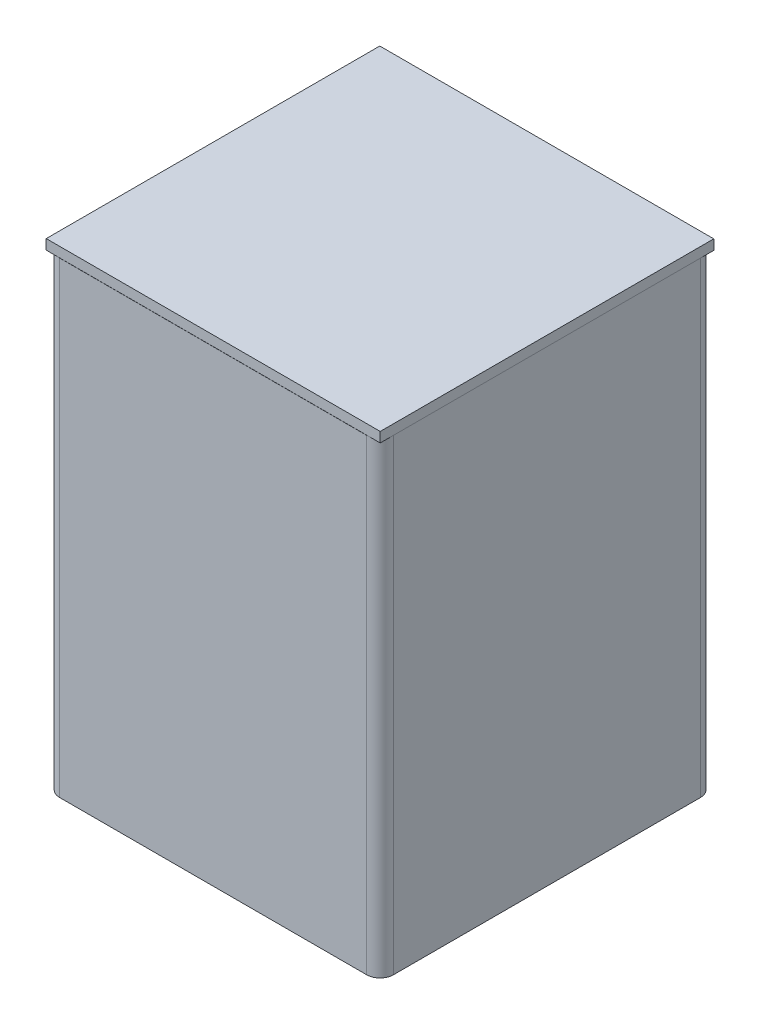
ISO-10303-21;
HEADER;
FILE_DESCRIPTION(('STEP AP214'),'2;1');
FILE_NAME('part.step','',(''),(''),'','','');
FILE_SCHEMA(('AUTOMOTIVE_DESIGN { 1 0 10303 214 1 1 1 1 }'));
ENDSEC;
DATA;
#1=APPLICATION_CONTEXT('core data for automotive mechanical design processes');
#2=APPLICATION_PROTOCOL_DEFINITION('international standard','automotive_design',2000,#1);
#3=PRODUCT_CONTEXT('',#1,'mechanical');
#4=PRODUCT('Part','Part','',(#3));
#5=PRODUCT_RELATED_PRODUCT_CATEGORY('part','',(#4));
#6=PRODUCT_DEFINITION_FORMATION('','',#4);
#7=PRODUCT_DEFINITION_CONTEXT('part definition',#1,'design');
#8=PRODUCT_DEFINITION('design','',#6,#7);
#9=PRODUCT_DEFINITION_SHAPE('','',#8);
#10=(LENGTH_UNIT() NAMED_UNIT(*) SI_UNIT(.MILLI.,.METRE.));
#11=(NAMED_UNIT(*) PLANE_ANGLE_UNIT() SI_UNIT($,.RADIAN.));
#12=(NAMED_UNIT(*) SI_UNIT($,.STERADIAN.) SOLID_ANGLE_UNIT());
#13=UNCERTAINTY_MEASURE_WITH_UNIT(LENGTH_MEASURE(1.E-05),#10,'distance_accuracy_value','');
#14=(GEOMETRIC_REPRESENTATION_CONTEXT(3) GLOBAL_UNCERTAINTY_ASSIGNED_CONTEXT((#13)) GLOBAL_UNIT_ASSIGNED_CONTEXT((#10,
#11,#12)) REPRESENTATION_CONTEXT('',''));
#15=CARTESIAN_POINT('',(0.,0.,0.));
#16=DIRECTION('',(0.,0.,1.));
#17=DIRECTION('',(1.,0.,0.));
#18=AXIS2_PLACEMENT_3D('',#15,#16,#17);
#19=CARTESIAN_POINT('',(59.0204470121358,181.61,107.541873644014));
#20=DIRECTION('',(0.,0.,1.));
#21=DIRECTION('',(1.,0.,0.));
#22=AXIS2_PLACEMENT_3D('',#19,#20,#21);
#23=PLANE('',#22);
#24=DIRECTION('',(-1.,0.,0.));
#25=VECTOR('',#24,1.);
#26=CARTESIAN_POINT('',(59.0204470121358,177.8,107.541873644014));
#27=LINE('',#26,#25);
#28=CARTESIAN_POINT('',(59.0204470121358,177.8,107.541873644014));
#29=VERTEX_POINT('',#28);
#30=CARTESIAN_POINT('',(-68.0926954382775,177.8,107.541873644014));
#31=VERTEX_POINT('',#30);
#32=EDGE_CURVE('E179',#29,#31,#27,.T.);
#33=ORIENTED_EDGE('',*,*,#32,.F.);
#34=DIRECTION('',(0.,-1.,0.));
#35=VECTOR('',#34,1.);
#36=CARTESIAN_POINT('',(59.0204470121358,181.61,107.541873644014));
#37=LINE('',#36,#35);
#38=CARTESIAN_POINT('',(59.0204470121358,181.61,107.541873644014));
#39=VERTEX_POINT('',#38);
#40=EDGE_CURVE('E12',#39,#29,#37,.T.);
#41=ORIENTED_EDGE('',*,*,#40,.F.);
#42=DIRECTION('',(-1.,0.,0.));
#43=VECTOR('',#42,1.);
#44=CARTESIAN_POINT('',(59.0204470121358,181.61,107.541873644014));
#45=LINE('',#44,#43);
#46=CARTESIAN_POINT('',(-68.0926954382775,181.61,107.541873644014));
#47=VERTEX_POINT('',#46);
#48=EDGE_CURVE('E185',#39,#47,#45,.T.);
#49=ORIENTED_EDGE('',*,*,#48,.T.);
#50=DIRECTION('',(0.,-1.,0.));
#51=VECTOR('',#50,1.);
#52=CARTESIAN_POINT('',(-68.0926954382775,181.61,107.541873644014));
#53=LINE('',#52,#51);
#54=EDGE_CURVE('E64',#47,#31,#53,.T.);
#55=ORIENTED_EDGE('',*,*,#54,.T.);
#56=EDGE_LOOP('',(#33,#41,#49,#55));
#57=FACE_BOUND('',#56,.T.);
#58=ADVANCED_FACE('F61',(#57),#23,.T.);
#59=CARTESIAN_POINT('',(59.0204470121358,181.61,-19.3985737263647));
#60=DIRECTION('',(1.,0.,0.));
#61=DIRECTION('',(0.,0.,-1.));
#62=AXIS2_PLACEMENT_3D('',#59,#60,#61);
#63=PLANE('',#62);
#64=DIRECTION('',(0.,0.,1.));
#65=VECTOR('',#64,1.);
#66=CARTESIAN_POINT('',(59.0204470121358,177.8,-19.3985737263647));
#67=LINE('',#66,#65);
#68=CARTESIAN_POINT('',(59.0204470121358,177.8,-19.3985737263647));
#69=VERTEX_POINT('',#68);
#70=EDGE_CURVE('E188',#69,#29,#67,.T.);
#71=ORIENTED_EDGE('',*,*,#70,.F.);
#72=DIRECTION('',(0.,-1.,0.));
#73=VECTOR('',#72,1.);
#74=CARTESIAN_POINT('',(59.0204470121358,181.61,-19.3985737263647));
#75=LINE('',#74,#73);
#76=CARTESIAN_POINT('',(59.0204470121358,181.61,-19.3985737263647));
#77=VERTEX_POINT('',#76);
#78=EDGE_CURVE('E70',#77,#69,#75,.T.);
#79=ORIENTED_EDGE('',*,*,#78,.F.);
#80=DIRECTION('',(0.,0.,1.));
#81=VECTOR('',#80,1.);
#82=CARTESIAN_POINT('',(59.0204470121358,181.61,-19.3985737263647));
#83=LINE('',#82,#81);
#84=EDGE_CURVE('E194',#77,#39,#83,.T.);
#85=ORIENTED_EDGE('',*,*,#84,.T.);
#86=ORIENTED_EDGE('',*,*,#40,.T.);
#87=EDGE_LOOP('',(#71,#79,#85,#86));
#88=FACE_BOUND('',#87,.T.);
#89=ADVANCED_FACE('F222',(#88),#63,.T.);
#90=CARTESIAN_POINT('',(59.0204470121358,181.61,-19.3985737263647));
#91=DIRECTION('',(0.,0.,1.));
#92=DIRECTION('',(1.,0.,0.));
#93=AXIS2_PLACEMENT_3D('',#90,#91,#92);
#94=PLANE('',#93);
#95=DIRECTION('',(-1.,0.,0.));
#96=VECTOR('',#95,1.);
#97=CARTESIAN_POINT('',(59.0204470121358,177.8,-19.3985737263647));
#98=LINE('',#97,#96);
#99=CARTESIAN_POINT('',(-68.0926954382775,177.8,-19.3985737263647));
#100=VERTEX_POINT('',#99);
#101=EDGE_CURVE('E204',#69,#100,#98,.T.);
#102=ORIENTED_EDGE('',*,*,#101,.T.);
#103=DIRECTION('',(0.,-1.,0.));
#104=VECTOR('',#103,1.);
#105=CARTESIAN_POINT('',(-68.0926954382775,181.61,-19.3985737263647));
#106=LINE('',#105,#104);
#107=CARTESIAN_POINT('',(-68.0926954382775,181.61,-19.3985737263647));
#108=VERTEX_POINT('',#107);
#109=EDGE_CURVE('E211',#108,#100,#106,.T.);
#110=ORIENTED_EDGE('',*,*,#109,.F.);
#111=DIRECTION('',(-1.,0.,0.));
#112=VECTOR('',#111,1.);
#113=CARTESIAN_POINT('',(59.0204470121358,181.61,-19.3985737263647));
#114=LINE('',#113,#112);
#115=EDGE_CURVE('E191',#77,#108,#114,.T.);
#116=ORIENTED_EDGE('',*,*,#115,.F.);
#117=ORIENTED_EDGE('',*,*,#78,.T.);
#118=EDGE_LOOP('',(#102,#110,#116,#117));
#119=FACE_BOUND('',#118,.T.);
#120=ADVANCED_FACE('F226',(#119),#94,.F.);
#121=CARTESIAN_POINT('',(-68.0926954382775,181.61,-19.3985737263647));
#122=DIRECTION('',(1.,0.,0.));
#123=DIRECTION('',(0.,0.,-1.));
#124=AXIS2_PLACEMENT_3D('',#121,#122,#123);
#125=PLANE('',#124);
#126=DIRECTION('',(0.,0.,1.));
#127=VECTOR('',#126,1.);
#128=CARTESIAN_POINT('',(-68.0926954382775,177.8,-19.3985737263647));
#129=LINE('',#128,#127);
#130=EDGE_CURVE('E200',#100,#31,#129,.T.);
#131=ORIENTED_EDGE('',*,*,#130,.T.);
#132=ORIENTED_EDGE('',*,*,#54,.F.);
#133=DIRECTION('',(0.,0.,1.));
#134=VECTOR('',#133,1.);
#135=CARTESIAN_POINT('',(-68.0926954382775,181.61,-19.3985737263647));
#136=LINE('',#135,#134);
#137=EDGE_CURVE('E111',#108,#47,#136,.T.);
#138=ORIENTED_EDGE('',*,*,#137,.F.);
#139=ORIENTED_EDGE('',*,*,#109,.T.);
#140=EDGE_LOOP('',(#131,#132,#138,#139));
#141=FACE_BOUND('',#140,.T.);
#142=ADVANCED_FACE('F218',(#141),#125,.F.);
#143=CARTESIAN_POINT('',(0.,181.61,0.));
#144=DIRECTION('',(0.,1.,0.));
#145=DIRECTION('',(0.,0.,1.));
#146=AXIS2_PLACEMENT_3D('',#143,#144,#145);
#147=PLANE('',#146);
#148=ORIENTED_EDGE('',*,*,#48,.F.);
#149=ORIENTED_EDGE('',*,*,#84,.F.);
#150=ORIENTED_EDGE('',*,*,#115,.T.);
#151=ORIENTED_EDGE('',*,*,#137,.T.);
#152=EDGE_LOOP('',(#148,#149,#150,#151));
#153=FACE_BOUND('',#152,.T.);
#154=ADVANCED_FACE('F227',(#153),#147,.T.);
#155=CARTESIAN_POINT('',(0.,177.8,0.));
#156=DIRECTION('',(0.,1.,0.));
#157=DIRECTION('',(0.,0.,1.));
#158=AXIS2_PLACEMENT_3D('',#155,#156,#157);
#159=PLANE('',#158);
#160=DIRECTION('',(0.,0.,1.));
#161=VECTOR('',#160,1.);
#162=CARTESIAN_POINT('',(-62.8995529878642,177.8,-14.3185737263647));
#163=LINE('',#162,#161);
#164=CARTESIAN_POINT('',(-62.8995529878642,177.8,-14.3185737263647));
#165=VERTEX_POINT('',#164);
#166=CARTESIAN_POINT('',(-62.8995529878642,177.8,102.521426273635));
#167=VERTEX_POINT('',#166);
#168=EDGE_CURVE('E160',#165,#167,#163,.T.);
#169=ORIENTED_EDGE('',*,*,#168,.T.);
#170=DIRECTION('',(1.,0.,0.));
#171=VECTOR('',#170,1.);
#172=CARTESIAN_POINT('',(-62.8995529878642,177.8,102.521426273635));
#173=LINE('',#172,#171);
#174=CARTESIAN_POINT('',(53.9404470121358,177.8,102.521426273635));
#175=VERTEX_POINT('',#174);
#176=EDGE_CURVE('E78',#167,#175,#173,.T.);
#177=ORIENTED_EDGE('',*,*,#176,.T.);
#178=DIRECTION('',(0.,0.,1.));
#179=VECTOR('',#178,1.);
#180=CARTESIAN_POINT('',(53.9404470121358,177.8,-14.3185737263647));
#181=LINE('',#180,#179);
#182=CARTESIAN_POINT('',(53.9404470121358,177.8,-14.3185737263647));
#183=VERTEX_POINT('',#182);
#184=EDGE_CURVE('E152',#183,#175,#181,.T.);
#185=ORIENTED_EDGE('',*,*,#184,.F.);
#186=DIRECTION('',(1.,0.,0.));
#187=VECTOR('',#186,1.);
#188=CARTESIAN_POINT('',(-62.8995529878642,177.8,-14.3185737263647));
#189=LINE('',#188,#187);
#190=EDGE_CURVE('E164',#165,#183,#189,.T.);
#191=ORIENTED_EDGE('',*,*,#190,.F.);
#192=EDGE_LOOP('',(#169,#177,#185,#191));
#193=FACE_BOUND('',#192,.T.);
#194=ORIENTED_EDGE('',*,*,#32,.T.);
#195=ORIENTED_EDGE('',*,*,#130,.F.);
#196=ORIENTED_EDGE('',*,*,#101,.F.);
#197=ORIENTED_EDGE('',*,*,#70,.T.);
#198=EDGE_LOOP('',(#194,#195,#196,#197));
#199=FACE_BOUND('',#198,.T.);
#200=ADVANCED_FACE('F221',(#193,#199),#159,.F.);
#201=CARTESIAN_POINT('',(-62.8995529878642,165.1,102.521426273635));
#202=DIRECTION('',(0.,0.,1.));
#203=DIRECTION('',(1.,0.,0.));
#204=AXIS2_PLACEMENT_3D('',#201,#202,#203);
#205=PLANE('',#204);
#206=ORIENTED_EDGE('',*,*,#176,.F.);
#207=DIRECTION('',(0.,1.,0.));
#208=VECTOR('',#207,1.);
#209=CARTESIAN_POINT('',(-62.8995529878642,165.1,102.521426273635));
#210=LINE('',#209,#208);
#211=CARTESIAN_POINT('',(-62.8995529878642,165.1,102.521426273635));
#212=VERTEX_POINT('',#211);
#213=EDGE_CURVE('E158',#212,#167,#210,.T.);
#214=ORIENTED_EDGE('',*,*,#213,.F.);
#215=DIRECTION('',(1.,0.,0.));
#216=VECTOR('',#215,1.);
#217=CARTESIAN_POINT('',(-62.8995529878642,165.1,102.521426273635));
#218=LINE('',#217,#216);
#219=CARTESIAN_POINT('',(53.9404470121358,165.1,102.521426273635));
#220=VERTEX_POINT('',#219);
#221=EDGE_CURVE('E139',#212,#220,#218,.T.);
#222=ORIENTED_EDGE('',*,*,#221,.T.);
#223=DIRECTION('',(0.,1.,0.));
#224=VECTOR('',#223,1.);
#225=CARTESIAN_POINT('',(53.9404470121358,165.1,102.521426273635));
#226=LINE('',#225,#224);
#227=EDGE_CURVE('E149',#220,#175,#226,.T.);
#228=ORIENTED_EDGE('',*,*,#227,.T.);
#229=EDGE_LOOP('',(#206,#214,#222,#228));
#230=FACE_BOUND('',#229,.T.);
#231=ADVANCED_FACE('F157',(#230),#205,.T.);
#232=CARTESIAN_POINT('',(-62.8995529878642,165.1,-14.3185737263647));
#233=DIRECTION('',(-1.,0.,0.));
#234=DIRECTION('',(0.,0.,1.));
#235=AXIS2_PLACEMENT_3D('',#232,#233,#234);
#236=PLANE('',#235);
#237=ORIENTED_EDGE('',*,*,#168,.F.);
#238=DIRECTION('',(0.,1.,0.));
#239=VECTOR('',#238,1.);
#240=CARTESIAN_POINT('',(-62.8995529878642,165.1,-14.3185737263647));
#241=LINE('',#240,#239);
#242=CARTESIAN_POINT('',(-62.8995529878642,165.1,-14.3185737263647));
#243=VERTEX_POINT('',#242);
#244=EDGE_CURVE('E180',#243,#165,#241,.T.);
#245=ORIENTED_EDGE('',*,*,#244,.F.);
#246=DIRECTION('',(0.,0.,1.));
#247=VECTOR('',#246,1.);
#248=CARTESIAN_POINT('',(-62.8995529878642,165.1,-14.3185737263647));
#249=LINE('',#248,#247);
#250=EDGE_CURVE('E155',#243,#212,#249,.T.);
#251=ORIENTED_EDGE('',*,*,#250,.T.);
#252=ORIENTED_EDGE('',*,*,#213,.T.);
#253=EDGE_LOOP('',(#237,#245,#251,#252));
#254=FACE_BOUND('',#253,.T.);
#255=ADVANCED_FACE('F281',(#254),#236,.T.);
#256=CARTESIAN_POINT('',(-62.8995529878642,165.1,-14.3185737263647));
#257=DIRECTION('',(0.,0.,1.));
#258=DIRECTION('',(1.,0.,0.));
#259=AXIS2_PLACEMENT_3D('',#256,#257,#258);
#260=PLANE('',#259);
#261=ORIENTED_EDGE('',*,*,#190,.T.);
#262=DIRECTION('',(0.,1.,0.));
#263=VECTOR('',#262,1.);
#264=CARTESIAN_POINT('',(53.9404470121358,165.1,-14.3185737263647));
#265=LINE('',#264,#263);
#266=CARTESIAN_POINT('',(53.9404470121358,165.1,-14.3185737263647));
#267=VERTEX_POINT('',#266);
#268=EDGE_CURVE('E154',#267,#183,#265,.T.);
#269=ORIENTED_EDGE('',*,*,#268,.F.);
#270=DIRECTION('',(1.,0.,0.));
#271=VECTOR('',#270,1.);
#272=CARTESIAN_POINT('',(-62.8995529878642,165.1,-14.3185737263647));
#273=LINE('',#272,#271);
#274=EDGE_CURVE('E142',#243,#267,#273,.T.);
#275=ORIENTED_EDGE('',*,*,#274,.F.);
#276=ORIENTED_EDGE('',*,*,#244,.T.);
#277=EDGE_LOOP('',(#261,#269,#275,#276));
#278=FACE_BOUND('',#277,.T.);
#279=ADVANCED_FACE('F289',(#278),#260,.F.);
#280=CARTESIAN_POINT('',(53.9404470121358,165.1,-14.3185737263647));
#281=DIRECTION('',(-1.,0.,0.));
#282=DIRECTION('',(0.,0.,1.));
#283=AXIS2_PLACEMENT_3D('',#280,#281,#282);
#284=PLANE('',#283);
#285=ORIENTED_EDGE('',*,*,#184,.T.);
#286=ORIENTED_EDGE('',*,*,#227,.F.);
#287=DIRECTION('',(0.,0.,1.));
#288=VECTOR('',#287,1.);
#289=CARTESIAN_POINT('',(53.9404470121358,165.1,-14.3185737263647));
#290=LINE('',#289,#288);
#291=EDGE_CURVE('E134',#267,#220,#290,.T.);
#292=ORIENTED_EDGE('',*,*,#291,.F.);
#293=ORIENTED_EDGE('',*,*,#268,.T.);
#294=EDGE_LOOP('',(#285,#286,#292,#293));
#295=FACE_BOUND('',#294,.T.);
#296=ADVANCED_FACE('F150',(#295),#284,.F.);
#297=CARTESIAN_POINT('',(0.,165.1,0.));
#298=DIRECTION('',(0.,-1.,0.));
#299=DIRECTION('',(0.,0.,-1.));
#300=AXIS2_PLACEMENT_3D('',#297,#298,#299);
#301=PLANE('',#300);
#302=ORIENTED_EDGE('',*,*,#221,.F.);
#303=ORIENTED_EDGE('',*,*,#250,.F.);
#304=ORIENTED_EDGE('',*,*,#274,.T.);
#305=ORIENTED_EDGE('',*,*,#291,.T.);
#306=EDGE_LOOP('',(#302,#303,#304,#305));
#307=FACE_BOUND('',#306,.T.);
#308=ADVANCED_FACE('F136',(#307),#301,.T.);
#309=CLOSED_SHELL('',(#58,#89,#120,#142,#154,#200,#231,#255,#279,#296,#308));
#310=MANIFOLD_SOLID_BREP('B2',#309);
#311=CARTESIAN_POINT('',(-67.9795529878642,177.8,-19.3985737263647));
#312=DIRECTION('',(1.,0.,0.));
#313=DIRECTION('',(0.,0.,-1.));
#314=AXIS2_PLACEMENT_3D('',#311,#312,#313);
#315=PLANE('',#314);
#316=DIRECTION('',(0.,0.,1.));
#317=VECTOR('',#316,1.);
#318=CARTESIAN_POINT('',(-67.9795529878642,177.8,-19.3985737263647));
#319=LINE('',#318,#317);
#320=CARTESIAN_POINT('',(-67.9795529878642,177.8,-14.3185737263647));
#321=VERTEX_POINT('',#320);
#322=CARTESIAN_POINT('',(-67.9795529878642,177.8,102.521426273635));
#323=VERTEX_POINT('',#322);
#324=EDGE_CURVE('E468',#321,#323,#319,.T.);
#325=ORIENTED_EDGE('',*,*,#324,.F.);
#326=DIRECTION('',(0.,-1.,0.));
#327=VECTOR('',#326,1.);
#328=CARTESIAN_POINT('',(-67.9795529878642,177.8,-14.3185737263647));
#329=LINE('',#328,#327);
#330=CARTESIAN_POINT('',(-67.9795529878642,0.,-14.3185737263647));
#331=VERTEX_POINT('',#330);
#332=EDGE_CURVE('E490',#321,#331,#329,.T.);
#333=ORIENTED_EDGE('',*,*,#332,.T.);
#334=DIRECTION('',(0.,0.,1.));
#335=VECTOR('',#334,1.);
#336=CARTESIAN_POINT('',(-67.9795529878642,0.,-19.3985737263647));
#337=LINE('',#336,#335);
#338=CARTESIAN_POINT('',(-67.9795529878642,0.,102.521426273635));
#339=VERTEX_POINT('',#338);
#340=EDGE_CURVE('E464',#331,#339,#337,.T.);
#341=ORIENTED_EDGE('',*,*,#340,.T.);
#342=DIRECTION('',(0.,-1.,0.));
#343=VECTOR('',#342,1.);
#344=CARTESIAN_POINT('',(-67.9795529878642,177.8,102.521426273635));
#345=LINE('',#344,#343);
#346=EDGE_CURVE('E479',#339,#323,#345,.F.);
#347=ORIENTED_EDGE('',*,*,#346,.T.);
#348=EDGE_LOOP('',(#325,#333,#341,#347));
#349=FACE_BOUND('',#348,.T.);
#350=ADVANCED_FACE('F335',(#349),#315,.F.);
#351=CARTESIAN_POINT('',(-67.9795529878642,177.8,107.601426273635));
#352=DIRECTION('',(0.,0.,-1.));
#353=DIRECTION('',(-1.,0.,0.));
#354=AXIS2_PLACEMENT_3D('',#351,#352,#353);
#355=PLANE('',#354);
#356=DIRECTION('',(1.,0.,0.));
#357=VECTOR('',#356,1.);
#358=CARTESIAN_POINT('',(-67.9795529878642,0.,107.601426273635));
#359=LINE('',#358,#357);
#360=CARTESIAN_POINT('',(-62.8995529878642,0.,107.601426273635));
#361=VERTEX_POINT('',#360);
#362=CARTESIAN_POINT('',(53.9404470121358,0.,107.601426273635));
#363=VERTEX_POINT('',#362);
#364=EDGE_CURVE('E482',#361,#363,#359,.T.);
#365=ORIENTED_EDGE('',*,*,#364,.T.);
#366=DIRECTION('',(0.,-1.,0.));
#367=VECTOR('',#366,1.);
#368=CARTESIAN_POINT('',(53.9404470121358,177.8,107.601426273635));
#369=LINE('',#368,#367);
#370=CARTESIAN_POINT('',(53.9404470121358,177.8,107.601426273635));
#371=VERTEX_POINT('',#370);
#372=EDGE_CURVE('E59',#363,#371,#369,.F.);
#373=ORIENTED_EDGE('',*,*,#372,.T.);
#374=DIRECTION('',(1.,0.,0.));
#375=VECTOR('',#374,1.);
#376=CARTESIAN_POINT('',(-67.9795529878642,177.8,107.601426273635));
#377=LINE('',#376,#375);
#378=CARTESIAN_POINT('',(-62.8995529878642,177.8,107.601426273635));
#379=VERTEX_POINT('',#378);
#380=EDGE_CURVE('E471',#379,#371,#377,.T.);
#381=ORIENTED_EDGE('',*,*,#380,.F.);
#382=DIRECTION('',(0.,-1.,0.));
#383=VECTOR('',#382,1.);
#384=CARTESIAN_POINT('',(-62.8995529878642,177.8,107.601426273635));
#385=LINE('',#384,#383);
#386=EDGE_CURVE('E343',#379,#361,#385,.T.);
#387=ORIENTED_EDGE('',*,*,#386,.T.);
#388=EDGE_LOOP('',(#365,#373,#381,#387));
#389=FACE_BOUND('',#388,.T.);
#390=ADVANCED_FACE('F521',(#389),#355,.F.);
#391=CARTESIAN_POINT('',(59.0204470121358,177.8,-19.3985737263647));
#392=DIRECTION('',(-1.,0.,0.));
#393=DIRECTION('',(0.,0.,1.));
#394=AXIS2_PLACEMENT_3D('',#391,#392,#393);
#395=PLANE('',#394);
#396=DIRECTION('',(0.,0.,-1.));
#397=VECTOR('',#396,1.);
#398=CARTESIAN_POINT('',(59.0204470121358,0.,-19.3985737263647));
#399=LINE('',#398,#397);
#400=CARTESIAN_POINT('',(59.0204470121358,0.,102.521426273635));
#401=VERTEX_POINT('',#400);
#402=CARTESIAN_POINT('',(59.0204470121358,0.,-14.3185737263647));
#403=VERTEX_POINT('',#402);
#404=EDGE_CURVE('E485',#401,#403,#399,.T.);
#405=ORIENTED_EDGE('',*,*,#404,.T.);
#406=DIRECTION('',(0.,-1.,0.));
#407=VECTOR('',#406,1.);
#408=CARTESIAN_POINT('',(59.0204470121358,177.8,-14.3185737263647));
#409=LINE('',#408,#407);
#410=CARTESIAN_POINT('',(59.0204470121358,177.8,-14.3185737263647));
#411=VERTEX_POINT('',#410);
#412=EDGE_CURVE('E350',#403,#411,#409,.F.);
#413=ORIENTED_EDGE('',*,*,#412,.T.);
#414=DIRECTION('',(0.,0.,-1.));
#415=VECTOR('',#414,1.);
#416=CARTESIAN_POINT('',(59.0204470121358,177.8,-19.3985737263647));
#417=LINE('',#416,#415);
#418=CARTESIAN_POINT('',(59.0204470121358,177.8,102.521426273635));
#419=VERTEX_POINT('',#418);
#420=EDGE_CURVE('E474',#419,#411,#417,.T.);
#421=ORIENTED_EDGE('',*,*,#420,.F.);
#422=DIRECTION('',(0.,-1.,0.));
#423=VECTOR('',#422,1.);
#424=CARTESIAN_POINT('',(59.0204470121358,177.8,102.521426273635));
#425=LINE('',#424,#423);
#426=EDGE_CURVE('E513',#419,#401,#425,.T.);
#427=ORIENTED_EDGE('',*,*,#426,.T.);
#428=EDGE_LOOP('',(#405,#413,#421,#427));
#429=FACE_BOUND('',#428,.T.);
#430=ADVANCED_FACE('F532',(#429),#395,.F.);
#431=CARTESIAN_POINT('',(-67.9795529878642,177.8,-19.3985737263647));
#432=DIRECTION('',(0.,0.,1.));
#433=DIRECTION('',(1.,0.,0.));
#434=AXIS2_PLACEMENT_3D('',#431,#432,#433);
#435=PLANE('',#434);
#436=DIRECTION('',(-1.,0.,0.));
#437=VECTOR('',#436,1.);
#438=CARTESIAN_POINT('',(-67.9795529878642,0.,-19.3985737263647));
#439=LINE('',#438,#437);
#440=CARTESIAN_POINT('',(53.9404470121358,0.,-19.3985737263647));
#441=VERTEX_POINT('',#440);
#442=CARTESIAN_POINT('',(-62.8995529878642,0.,-19.3985737263647));
#443=VERTEX_POINT('',#442);
#444=EDGE_CURVE('E472',#441,#443,#439,.T.);
#445=ORIENTED_EDGE('',*,*,#444,.T.);
#446=DIRECTION('',(0.,-1.,0.));
#447=VECTOR('',#446,1.);
#448=CARTESIAN_POINT('',(-62.8995529878642,177.8,-19.3985737263647));
#449=LINE('',#448,#447);
#450=CARTESIAN_POINT('',(-62.8995529878642,177.8,-19.3985737263647));
#451=VERTEX_POINT('',#450);
#452=EDGE_CURVE('E504',#443,#451,#449,.F.);
#453=ORIENTED_EDGE('',*,*,#452,.T.);
#454=DIRECTION('',(-1.,0.,0.));
#455=VECTOR('',#454,1.);
#456=CARTESIAN_POINT('',(-67.9795529878642,177.8,-19.3985737263647));
#457=LINE('',#456,#455);
#458=CARTESIAN_POINT('',(53.9404470121358,177.8,-19.3985737263647));
#459=VERTEX_POINT('',#458);
#460=EDGE_CURVE('E476',#459,#451,#457,.T.);
#461=ORIENTED_EDGE('',*,*,#460,.F.);
#462=DIRECTION('',(0.,-1.,0.));
#463=VECTOR('',#462,1.);
#464=CARTESIAN_POINT('',(53.9404470121358,177.8,-19.3985737263647));
#465=LINE('',#464,#463);
#466=EDGE_CURVE('E501',#459,#441,#465,.T.);
#467=ORIENTED_EDGE('',*,*,#466,.T.);
#468=EDGE_LOOP('',(#445,#453,#461,#467));
#469=FACE_BOUND('',#468,.T.);
#470=ADVANCED_FACE('F541',(#469),#435,.F.);
#471=CARTESIAN_POINT('',(0.,177.8,0.));
#472=DIRECTION('',(0.,1.,0.));
#473=DIRECTION('',(0.,0.,1.));
#474=AXIS2_PLACEMENT_3D('',#471,#472,#473);
#475=PLANE('',#474);
#476=DIRECTION('',(0.,0.,1.));
#477=VECTOR('',#476,1.);
#478=CARTESIAN_POINT('',(-64.1695529878642,177.8,-15.5885737263647));
#479=LINE('',#478,#477);
#480=CARTESIAN_POINT('',(-64.1695529878642,177.8,-15.5885737263647));
#481=VERTEX_POINT('',#480);
#482=CARTESIAN_POINT('',(-64.1695529878642,177.8,103.791426273635));
#483=VERTEX_POINT('',#482);
#484=EDGE_CURVE('E432',#481,#483,#479,.T.);
#485=ORIENTED_EDGE('',*,*,#484,.F.);
#486=DIRECTION('',(-1.,0.,0.));
#487=VECTOR('',#486,1.);
#488=CARTESIAN_POINT('',(-64.1695529878642,177.8,-15.5885737263647));
#489=LINE('',#488,#487);
#490=CARTESIAN_POINT('',(55.2104470121358,177.8,-15.5885737263647));
#491=VERTEX_POINT('',#490);
#492=EDGE_CURVE('E449',#491,#481,#489,.T.);
#493=ORIENTED_EDGE('',*,*,#492,.F.);
#494=DIRECTION('',(0.,0.,-1.));
#495=VECTOR('',#494,1.);
#496=CARTESIAN_POINT('',(55.2104470121358,177.8,-15.5885737263647));
#497=LINE('',#496,#495);
#498=CARTESIAN_POINT('',(55.2104470121358,177.8,103.791426273635));
#499=VERTEX_POINT('',#498);
#500=EDGE_CURVE('E452',#499,#491,#497,.T.);
#501=ORIENTED_EDGE('',*,*,#500,.F.);
#502=DIRECTION('',(1.,0.,0.));
#503=VECTOR('',#502,1.);
#504=CARTESIAN_POINT('',(-64.1695529878642,177.8,103.791426273635));
#505=LINE('',#504,#503);
#506=EDGE_CURVE('E458',#483,#499,#505,.T.);
#507=ORIENTED_EDGE('',*,*,#506,.F.);
#508=EDGE_LOOP('',(#485,#493,#501,#507));
#509=FACE_BOUND('',#508,.T.);
#510=ORIENTED_EDGE('',*,*,#460,.T.);
#511=CARTESIAN_POINT('',(-62.8995529878642,177.8,-14.3185737263647));
#512=DIRECTION('',(0.,1.,0.));
#513=DIRECTION('',(0.,0.,1.));
#514=AXIS2_PLACEMENT_3D('',#511,#512,#513);
#515=CIRCLE('',#514,5.08);
#516=EDGE_CURVE('E511',#451,#321,#515,.T.);
#517=ORIENTED_EDGE('',*,*,#516,.T.);
#518=ORIENTED_EDGE('',*,*,#324,.T.);
#519=CARTESIAN_POINT('',(-62.8995529878642,177.8,102.521426273635));
#520=DIRECTION('',(0.,1.,0.));
#521=DIRECTION('',(0.,0.,1.));
#522=AXIS2_PLACEMENT_3D('',#519,#520,#521);
#523=CIRCLE('',#522,5.08);
#524=EDGE_CURVE('E506',#323,#379,#523,.T.);
#525=ORIENTED_EDGE('',*,*,#524,.T.);
#526=ORIENTED_EDGE('',*,*,#380,.T.);
#527=CARTESIAN_POINT('',(53.9404470121358,177.8,102.521426273635));
#528=DIRECTION('',(0.,1.,0.));
#529=DIRECTION('',(0.,0.,1.));
#530=AXIS2_PLACEMENT_3D('',#527,#528,#529);
#531=CIRCLE('',#530,5.08);
#532=EDGE_CURVE('E357',#371,#419,#531,.T.);
#533=ORIENTED_EDGE('',*,*,#532,.T.);
#534=ORIENTED_EDGE('',*,*,#420,.T.);
#535=CARTESIAN_POINT('',(53.9404470121358,177.8,-14.3185737263647));
#536=DIRECTION('',(0.,1.,0.));
#537=DIRECTION('',(0.,0.,1.));
#538=AXIS2_PLACEMENT_3D('',#535,#536,#537);
#539=CIRCLE('',#538,5.08);
#540=EDGE_CURVE('E509',#411,#459,#539,.T.);
#541=ORIENTED_EDGE('',*,*,#540,.T.);
#542=EDGE_LOOP('',(#510,#517,#518,#525,#526,#533,#534,#541));
#543=FACE_BOUND('',#542,.T.);
#544=ADVANCED_FACE('F534',(#509,#543),#475,.T.);
#545=CARTESIAN_POINT('',(0.,0.,0.));
#546=DIRECTION('',(0.,1.,0.));
#547=DIRECTION('',(0.,0.,1.));
#548=AXIS2_PLACEMENT_3D('',#545,#546,#547);
#549=PLANE('',#548);
#550=ORIENTED_EDGE('',*,*,#340,.F.);
#551=CARTESIAN_POINT('',(-62.8995529878642,0.,-14.3185737263647));
#552=DIRECTION('',(0.,1.,0.));
#553=DIRECTION('',(0.,0.,1.));
#554=AXIS2_PLACEMENT_3D('',#551,#552,#553);
#555=CIRCLE('',#554,5.08);
#556=EDGE_CURVE('E499',#331,#443,#555,.F.);
#557=ORIENTED_EDGE('',*,*,#556,.T.);
#558=ORIENTED_EDGE('',*,*,#444,.F.);
#559=CARTESIAN_POINT('',(53.9404470121358,0.,-14.3185737263647));
#560=DIRECTION('',(0.,1.,0.));
#561=DIRECTION('',(0.,0.,1.));
#562=AXIS2_PLACEMENT_3D('',#559,#560,#561);
#563=CIRCLE('',#562,5.08);
#564=EDGE_CURVE('E497',#441,#403,#563,.F.);
#565=ORIENTED_EDGE('',*,*,#564,.T.);
#566=ORIENTED_EDGE('',*,*,#404,.F.);
#567=CARTESIAN_POINT('',(53.9404470121358,0.,102.521426273635));
#568=DIRECTION('',(0.,1.,0.));
#569=DIRECTION('',(0.,0.,1.));
#570=AXIS2_PLACEMENT_3D('',#567,#568,#569);
#571=CIRCLE('',#570,5.08);
#572=EDGE_CURVE('E495',#401,#363,#571,.F.);
#573=ORIENTED_EDGE('',*,*,#572,.T.);
#574=ORIENTED_EDGE('',*,*,#364,.F.);
#575=CARTESIAN_POINT('',(-62.8995529878642,0.,102.521426273635));
#576=DIRECTION('',(0.,1.,0.));
#577=DIRECTION('',(0.,0.,1.));
#578=AXIS2_PLACEMENT_3D('',#575,#576,#577);
#579=CIRCLE('',#578,5.08);
#580=EDGE_CURVE('E493',#361,#339,#579,.F.);
#581=ORIENTED_EDGE('',*,*,#580,.T.);
#582=EDGE_LOOP('',(#550,#557,#558,#565,#566,#573,#574,#581));
#583=FACE_BOUND('',#582,.T.);
#584=ADVANCED_FACE('F527',(#583),#549,.F.);
#585=CARTESIAN_POINT('',(-64.1695529878642,3.81000000000001,-15.5885737263647));
#586=DIRECTION('',(-1.,0.,0.));
#587=DIRECTION('',(0.,0.,1.));
#588=AXIS2_PLACEMENT_3D('',#585,#586,#587);
#589=PLANE('',#588);
#590=ORIENTED_EDGE('',*,*,#484,.T.);
#591=DIRECTION('',(0.,1.,0.));
#592=VECTOR('',#591,1.);
#593=CARTESIAN_POINT('',(-64.1695529878642,3.81000000000001,103.791426273635));
#594=LINE('',#593,#592);
#595=CARTESIAN_POINT('',(-64.1695529878642,3.81000000000001,103.791426273635));
#596=VERTEX_POINT('',#595);
#597=EDGE_CURVE('E425',#596,#483,#594,.T.);
#598=ORIENTED_EDGE('',*,*,#597,.F.);
#599=DIRECTION('',(0.,0.,1.));
#600=VECTOR('',#599,1.);
#601=CARTESIAN_POINT('',(-64.1695529878642,3.81000000000001,-15.5885737263647));
#602=LINE('',#601,#600);
#603=CARTESIAN_POINT('',(-64.1695529878642,3.81000000000001,-15.5885737263647));
#604=VERTEX_POINT('',#603);
#605=EDGE_CURVE('E429',#604,#596,#602,.T.);
#606=ORIENTED_EDGE('',*,*,#605,.F.);
#607=DIRECTION('',(0.,1.,0.));
#608=VECTOR('',#607,1.);
#609=CARTESIAN_POINT('',(-64.1695529878642,3.81000000000001,-15.5885737263647));
#610=LINE('',#609,#608);
#611=EDGE_CURVE('E462',#604,#481,#610,.T.);
#612=ORIENTED_EDGE('',*,*,#611,.T.);
#613=EDGE_LOOP('',(#590,#598,#606,#612));
#614=FACE_BOUND('',#613,.T.);
#615=ADVANCED_FACE('F427',(#614),#589,.F.);
#616=CARTESIAN_POINT('',(-64.1695529878642,3.81000000000001,-15.5885737263647));
#617=DIRECTION('',(0.,0.,-1.));
#618=DIRECTION('',(-1.,0.,0.));
#619=AXIS2_PLACEMENT_3D('',#616,#617,#618);
#620=PLANE('',#619);
#621=ORIENTED_EDGE('',*,*,#492,.T.);
#622=ORIENTED_EDGE('',*,*,#611,.F.);
#623=DIRECTION('',(-1.,0.,0.));
#624=VECTOR('',#623,1.);
#625=CARTESIAN_POINT('',(-64.1695529878642,3.81000000000001,-15.5885737263647));
#626=LINE('',#625,#624);
#627=CARTESIAN_POINT('',(55.2104470121358,3.81000000000001,-15.5885737263647));
#628=VERTEX_POINT('',#627);
#629=EDGE_CURVE('E437',#628,#604,#626,.T.);
#630=ORIENTED_EDGE('',*,*,#629,.F.);
#631=DIRECTION('',(0.,1.,0.));
#632=VECTOR('',#631,1.);
#633=CARTESIAN_POINT('',(55.2104470121358,3.81000000000001,-15.5885737263647));
#634=LINE('',#633,#632);
#635=EDGE_CURVE('E465',#628,#491,#634,.T.);
#636=ORIENTED_EDGE('',*,*,#635,.T.);
#637=EDGE_LOOP('',(#621,#622,#630,#636));
#638=FACE_BOUND('',#637,.T.);
#639=ADVANCED_FACE('F608',(#638),#620,.F.);
#640=CARTESIAN_POINT('',(55.2104470121358,3.81000000000001,-15.5885737263647));
#641=DIRECTION('',(1.,0.,0.));
#642=DIRECTION('',(0.,0.,-1.));
#643=AXIS2_PLACEMENT_3D('',#640,#641,#642);
#644=PLANE('',#643);
#645=ORIENTED_EDGE('',*,*,#500,.T.);
#646=ORIENTED_EDGE('',*,*,#635,.F.);
#647=DIRECTION('',(0.,0.,-1.));
#648=VECTOR('',#647,1.);
#649=CARTESIAN_POINT('',(55.2104470121358,3.81000000000001,-15.5885737263647));
#650=LINE('',#649,#648);
#651=CARTESIAN_POINT('',(55.2104470121358,3.81000000000001,103.791426273635));
#652=VERTEX_POINT('',#651);
#653=EDGE_CURVE('E445',#652,#628,#650,.T.);
#654=ORIENTED_EDGE('',*,*,#653,.F.);
#655=DIRECTION('',(0.,1.,0.));
#656=VECTOR('',#655,1.);
#657=CARTESIAN_POINT('',(55.2104470121358,3.81000000000001,103.791426273635));
#658=LINE('',#657,#656);
#659=EDGE_CURVE('E436',#652,#499,#658,.T.);
#660=ORIENTED_EDGE('',*,*,#659,.T.);
#661=EDGE_LOOP('',(#645,#646,#654,#660));
#662=FACE_BOUND('',#661,.T.);
#663=ADVANCED_FACE('F600',(#662),#644,.F.);
#664=CARTESIAN_POINT('',(-64.1695529878642,3.81000000000001,103.791426273635));
#665=DIRECTION('',(0.,0.,1.));
#666=DIRECTION('',(1.,0.,0.));
#667=AXIS2_PLACEMENT_3D('',#664,#665,#666);
#668=PLANE('',#667);
#669=ORIENTED_EDGE('',*,*,#506,.T.);
#670=ORIENTED_EDGE('',*,*,#659,.F.);
#671=DIRECTION('',(1.,0.,0.));
#672=VECTOR('',#671,1.);
#673=CARTESIAN_POINT('',(-64.1695529878642,3.81000000000001,103.791426273635));
#674=LINE('',#673,#672);
#675=EDGE_CURVE('E440',#596,#652,#674,.T.);
#676=ORIENTED_EDGE('',*,*,#675,.F.);
#677=ORIENTED_EDGE('',*,*,#597,.T.);
#678=EDGE_LOOP('',(#669,#670,#676,#677));
#679=FACE_BOUND('',#678,.T.);
#680=ADVANCED_FACE('F441',(#679),#668,.F.);
#681=CARTESIAN_POINT('',(0.,3.81000000000001,0.));
#682=DIRECTION('',(0.,1.,0.));
#683=DIRECTION('',(0.,0.,1.));
#684=AXIS2_PLACEMENT_3D('',#681,#682,#683);
#685=PLANE('',#684);
#686=ORIENTED_EDGE('',*,*,#605,.T.);
#687=ORIENTED_EDGE('',*,*,#675,.T.);
#688=ORIENTED_EDGE('',*,*,#653,.T.);
#689=ORIENTED_EDGE('',*,*,#629,.T.);
#690=EDGE_LOOP('',(#686,#687,#688,#689));
#691=FACE_BOUND('',#690,.T.);
#692=ADVANCED_FACE('F447',(#691),#685,.T.);
#693=CARTESIAN_POINT('',(-62.8995529878642,177.8,-14.3185737263647));
#694=DIRECTION('',(0.,-1.,0.));
#695=DIRECTION('',(0.,0.,-1.));
#696=AXIS2_PLACEMENT_3D('',#693,#694,#695);
#697=CYLINDRICAL_SURFACE('',#696,5.08);
#698=ORIENTED_EDGE('',*,*,#516,.F.);
#699=ORIENTED_EDGE('',*,*,#452,.F.);
#700=ORIENTED_EDGE('',*,*,#556,.F.);
#701=ORIENTED_EDGE('',*,*,#332,.F.);
#702=EDGE_LOOP('',(#698,#699,#700,#701));
#703=FACE_BOUND('',#702,.T.);
#704=ADVANCED_FACE('F546',(#703),#697,.T.);
#705=CARTESIAN_POINT('',(53.9404470121358,177.8,-14.3185737263647));
#706=DIRECTION('',(0.,-1.,0.));
#707=DIRECTION('',(0.,0.,-1.));
#708=AXIS2_PLACEMENT_3D('',#705,#706,#707);
#709=CYLINDRICAL_SURFACE('',#708,5.08);
#710=ORIENTED_EDGE('',*,*,#540,.F.);
#711=ORIENTED_EDGE('',*,*,#412,.F.);
#712=ORIENTED_EDGE('',*,*,#564,.F.);
#713=ORIENTED_EDGE('',*,*,#466,.F.);
#714=EDGE_LOOP('',(#710,#711,#712,#713));
#715=FACE_BOUND('',#714,.T.);
#716=ADVANCED_FACE('F538',(#715),#709,.T.);
#717=CARTESIAN_POINT('',(53.9404470121358,177.8,102.521426273635));
#718=DIRECTION('',(0.,-1.,0.));
#719=DIRECTION('',(0.,0.,-1.));
#720=AXIS2_PLACEMENT_3D('',#717,#718,#719);
#721=CYLINDRICAL_SURFACE('',#720,5.08);
#722=ORIENTED_EDGE('',*,*,#532,.F.);
#723=ORIENTED_EDGE('',*,*,#372,.F.);
#724=ORIENTED_EDGE('',*,*,#572,.F.);
#725=ORIENTED_EDGE('',*,*,#426,.F.);
#726=EDGE_LOOP('',(#722,#723,#724,#725));
#727=FACE_BOUND('',#726,.T.);
#728=ADVANCED_FACE('F531',(#727),#721,.T.);
#729=CARTESIAN_POINT('',(-62.8995529878642,177.8,102.521426273635));
#730=DIRECTION('',(0.,-1.,0.));
#731=DIRECTION('',(0.,0.,-1.));
#732=AXIS2_PLACEMENT_3D('',#729,#730,#731);
#733=CYLINDRICAL_SURFACE('',#732,5.08);
#734=ORIENTED_EDGE('',*,*,#524,.F.);
#735=ORIENTED_EDGE('',*,*,#346,.F.);
#736=ORIENTED_EDGE('',*,*,#580,.F.);
#737=ORIENTED_EDGE('',*,*,#386,.F.);
#738=EDGE_LOOP('',(#734,#735,#736,#737));
#739=FACE_BOUND('',#738,.T.);
#740=ADVANCED_FACE('F337',(#739),#733,.T.);
#741=CLOSED_SHELL('',(#350,#390,#430,#470,#544,#584,#615,#639,#663,#680,#692,#704,#716,#728,#740));
#742=MANIFOLD_SOLID_BREP('B6',#741);
#743=ADVANCED_BREP_SHAPE_REPRESENTATION('',(#18,#310,#742),#14);
#744=SHAPE_DEFINITION_REPRESENTATION(#9,#743);
ENDSEC;
END-ISO-10303-21;
